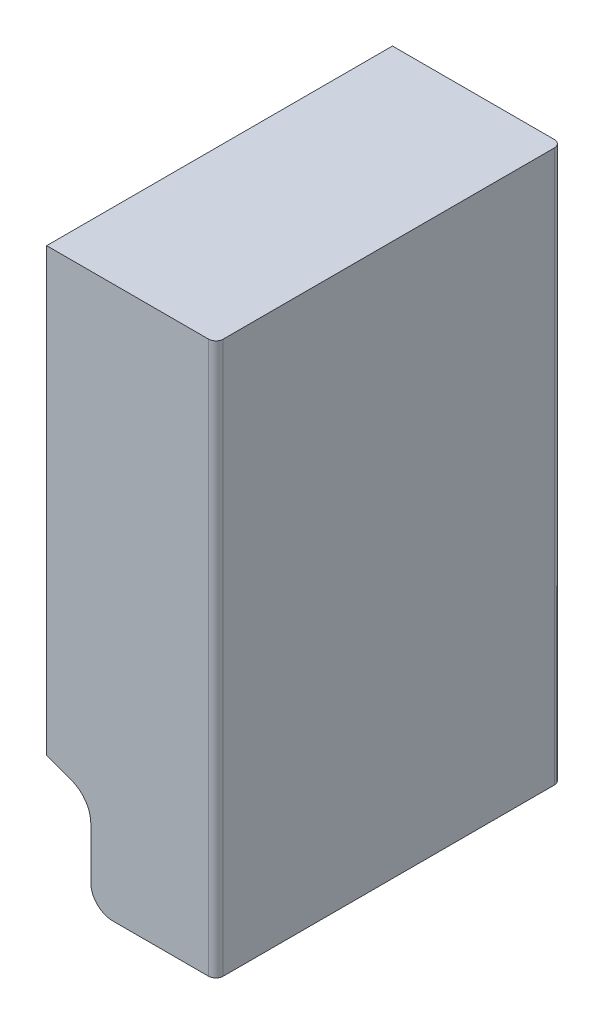
ISO-10303-21;
HEADER;
FILE_DESCRIPTION(('STEP AP214'),'2;1');
FILE_NAME('part.step','',(''),(''),'','','');
FILE_SCHEMA(('AUTOMOTIVE_DESIGN { 1 0 10303 214 1 1 1 1 }'));
ENDSEC;
DATA;
#1=APPLICATION_CONTEXT('core data for automotive mechanical design processes');
#2=APPLICATION_PROTOCOL_DEFINITION('international standard','automotive_design',2000,#1);
#3=PRODUCT_CONTEXT('',#1,'mechanical');
#4=PRODUCT('Part','Part','',(#3));
#5=PRODUCT_RELATED_PRODUCT_CATEGORY('part','',(#4));
#6=PRODUCT_DEFINITION_FORMATION('','',#4);
#7=PRODUCT_DEFINITION_CONTEXT('part definition',#1,'design');
#8=PRODUCT_DEFINITION('design','',#6,#7);
#9=PRODUCT_DEFINITION_SHAPE('','',#8);
#10=(LENGTH_UNIT() NAMED_UNIT(*) SI_UNIT(.MILLI.,.METRE.));
#11=(NAMED_UNIT(*) PLANE_ANGLE_UNIT() SI_UNIT($,.RADIAN.));
#12=(NAMED_UNIT(*) SI_UNIT($,.STERADIAN.) SOLID_ANGLE_UNIT());
#13=UNCERTAINTY_MEASURE_WITH_UNIT(LENGTH_MEASURE(1.E-05),#10,'distance_accuracy_value','');
#14=(GEOMETRIC_REPRESENTATION_CONTEXT(3) GLOBAL_UNCERTAINTY_ASSIGNED_CONTEXT((#13)) GLOBAL_UNIT_ASSIGNED_CONTEXT((#10,
#11,#12)) REPRESENTATION_CONTEXT('',''));
#15=CARTESIAN_POINT('',(0.,0.,0.));
#16=DIRECTION('',(0.,0.,1.));
#17=DIRECTION('',(1.,0.,0.));
#18=AXIS2_PLACEMENT_3D('',#15,#16,#17);
#19=CARTESIAN_POINT('',(11.5,-75.,23.5));
#20=DIRECTION('',(1.,0.,0.));
#21=DIRECTION('',(0.,0.,-1.));
#22=AXIS2_PLACEMENT_3D('',#19,#20,#21);
#23=PLANE('',#22);
#24=DIRECTION('',(0.,0.,-1.));
#25=VECTOR('',#24,1.);
#26=CARTESIAN_POINT('',(11.5,-75.,23.5));
#27=LINE('',#26,#25);
#28=CARTESIAN_POINT('',(11.5,-75.,22.5));
#29=VERTEX_POINT('',#28);
#30=CARTESIAN_POINT('',(11.5,-75.,-22.5));
#31=VERTEX_POINT('',#30);
#32=EDGE_CURVE('E176',#29,#31,#27,.T.);
#33=ORIENTED_EDGE('',*,*,#32,.T.);
#34=DIRECTION('',(0.,1.,0.));
#35=VECTOR('',#34,1.);
#36=CARTESIAN_POINT('',(11.5,-75.,-22.5));
#37=LINE('',#36,#35);
#38=CARTESIAN_POINT('',(11.5,0.,-22.5));
#39=VERTEX_POINT('',#38);
#40=EDGE_CURVE('E165',#31,#39,#37,.T.);
#41=ORIENTED_EDGE('',*,*,#40,.T.);
#42=DIRECTION('',(0.,0.,-1.));
#43=VECTOR('',#42,1.);
#44=CARTESIAN_POINT('',(11.5,0.,23.5));
#45=LINE('',#44,#43);
#46=CARTESIAN_POINT('',(11.5,0.,22.5));
#47=VERTEX_POINT('',#46);
#48=EDGE_CURVE('E130',#47,#39,#45,.T.);
#49=ORIENTED_EDGE('',*,*,#48,.F.);
#50=DIRECTION('',(0.,1.,0.));
#51=VECTOR('',#50,1.);
#52=CARTESIAN_POINT('',(11.5,-75.,22.5));
#53=LINE('',#52,#51);
#54=EDGE_CURVE('E163',#47,#29,#53,.F.);
#55=ORIENTED_EDGE('',*,*,#54,.T.);
#56=EDGE_LOOP('',(#33,#41,#49,#55));
#57=FACE_BOUND('',#56,.T.);
#58=ADVANCED_FACE('F41',(#57),#23,.T.);
#59=CARTESIAN_POINT('',(-11.5,-75.,23.5));
#60=DIRECTION('',(0.,0.,1.));
#61=DIRECTION('',(1.,0.,0.));
#62=AXIS2_PLACEMENT_3D('',#59,#60,#61);
#63=PLANE('',#62);
#64=DIRECTION('',(1.,0.,0.));
#65=VECTOR('',#64,1.);
#66=CARTESIAN_POINT('',(-11.5,-75.,23.5));
#67=LINE('',#66,#65);
#68=CARTESIAN_POINT('',(-2.50000000000001,-75.,23.5));
#69=VERTEX_POINT('',#68);
#70=CARTESIAN_POINT('',(10.5,-75.,23.5));
#71=VERTEX_POINT('',#70);
#72=EDGE_CURVE('E146',#69,#71,#67,.T.);
#73=ORIENTED_EDGE('',*,*,#72,.T.);
#74=DIRECTION('',(0.,1.,0.));
#75=VECTOR('',#74,1.);
#76=CARTESIAN_POINT('',(10.5,-75.,23.5));
#77=LINE('',#76,#75);
#78=CARTESIAN_POINT('',(10.5,0.,23.5));
#79=VERTEX_POINT('',#78);
#80=EDGE_CURVE('E11',#71,#79,#77,.T.);
#81=ORIENTED_EDGE('',*,*,#80,.T.);
#82=DIRECTION('',(1.,0.,0.));
#83=VECTOR('',#82,1.);
#84=CARTESIAN_POINT('',(-11.5,0.,23.5));
#85=LINE('',#84,#83);
#86=CARTESIAN_POINT('',(-11.5,0.,23.5));
#87=VERTEX_POINT('',#86);
#88=EDGE_CURVE('E183',#87,#79,#85,.T.);
#89=ORIENTED_EDGE('',*,*,#88,.F.);
#90=DIRECTION('',(0.,1.,0.));
#91=VECTOR('',#90,1.);
#92=CARTESIAN_POINT('',(-11.5,-75.,23.5));
#93=LINE('',#92,#91);
#94=CARTESIAN_POINT('',(-11.5,-60.015348441564,23.5));
#95=VERTEX_POINT('',#94);
#96=EDGE_CURVE('E145',#95,#87,#93,.T.);
#97=ORIENTED_EDGE('',*,*,#96,.F.);
#98=DIRECTION('',(-0.939692620785907,0.342020143325672,0.));
#99=VECTOR('',#98,1.);
#100=CARTESIAN_POINT('',(-8.13191942669733,-61.2412295168564,23.5));
#101=LINE('',#100,#99);
#102=CARTESIAN_POINT('',(-8.13191942669733,-61.2412295168564,23.5));
#103=VERTEX_POINT('',#102);
#104=EDGE_CURVE('E126',#103,#95,#101,.T.);
#105=ORIENTED_EDGE('',*,*,#104,.F.);
#106=CARTESIAN_POINT('',(-9.50000000000001,-65.,23.5));
#107=DIRECTION('',(0.,0.,1.));
#108=DIRECTION('',(1.,0.,0.));
#109=AXIS2_PLACEMENT_3D('',#106,#107,#108);
#110=CIRCLE('',#109,4.);
#111=CARTESIAN_POINT('',(-5.50000000000001,-65.,23.5));
#112=VERTEX_POINT('',#111);
#113=EDGE_CURVE('E234',#112,#103,#110,.T.);
#114=ORIENTED_EDGE('',*,*,#113,.F.);
#115=DIRECTION('',(0.,1.,0.));
#116=VECTOR('',#115,1.);
#117=CARTESIAN_POINT('',(-5.50000000000001,-65.,23.5));
#118=LINE('',#117,#116);
#119=CARTESIAN_POINT('',(-5.50000000000001,-72.,23.5));
#120=VERTEX_POINT('',#119);
#121=EDGE_CURVE('E140',#120,#112,#118,.T.);
#122=ORIENTED_EDGE('',*,*,#121,.F.);
#123=CARTESIAN_POINT('',(-2.50000000000001,-72.,23.5));
#124=DIRECTION('',(0.,0.,1.));
#125=DIRECTION('',(1.,0.,0.));
#126=AXIS2_PLACEMENT_3D('',#123,#124,#125);
#127=CIRCLE('',#126,3.);
#128=EDGE_CURVE('E156',#120,#69,#127,.T.);
#129=ORIENTED_EDGE('',*,*,#128,.T.);
#130=EDGE_LOOP('',(#73,#81,#89,#97,#105,#114,#122,#129));
#131=FACE_BOUND('',#130,.T.);
#132=ADVANCED_FACE('F195',(#131),#63,.T.);
#133=CARTESIAN_POINT('',(-11.5,-75.,23.5));
#134=DIRECTION('',(-1.,0.,0.));
#135=DIRECTION('',(0.,0.,1.));
#136=AXIS2_PLACEMENT_3D('',#133,#134,#135);
#137=PLANE('',#136);
#138=DIRECTION('',(0.,0.,1.));
#139=VECTOR('',#138,1.);
#140=CARTESIAN_POINT('',(-11.5,-60.015348441564,-23.501));
#141=LINE('',#140,#139);
#142=CARTESIAN_POINT('',(-11.5,-60.015348441564,-23.5));
#143=VERTEX_POINT('',#142);
#144=EDGE_CURVE('E120',#143,#95,#141,.T.);
#145=ORIENTED_EDGE('',*,*,#144,.T.);
#146=ORIENTED_EDGE('',*,*,#96,.T.);
#147=DIRECTION('',(0.,0.,1.));
#148=VECTOR('',#147,1.);
#149=CARTESIAN_POINT('',(-11.5,0.,23.5));
#150=LINE('',#149,#148);
#151=CARTESIAN_POINT('',(-11.5,0.,-23.5));
#152=VERTEX_POINT('',#151);
#153=EDGE_CURVE('E144',#152,#87,#150,.T.);
#154=ORIENTED_EDGE('',*,*,#153,.F.);
#155=DIRECTION('',(0.,1.,0.));
#156=VECTOR('',#155,1.);
#157=CARTESIAN_POINT('',(-11.5,-75.,-23.5));
#158=LINE('',#157,#156);
#159=EDGE_CURVE('E136',#143,#152,#158,.T.);
#160=ORIENTED_EDGE('',*,*,#159,.F.);
#161=EDGE_LOOP('',(#145,#146,#154,#160));
#162=FACE_BOUND('',#161,.T.);
#163=ADVANCED_FACE('F142',(#162),#137,.T.);
#164=CARTESIAN_POINT('',(-11.5,-75.,-23.5));
#165=DIRECTION('',(0.,0.,-1.));
#166=DIRECTION('',(-1.,0.,0.));
#167=AXIS2_PLACEMENT_3D('',#164,#165,#166);
#168=PLANE('',#167);
#169=DIRECTION('',(-1.,0.,0.));
#170=VECTOR('',#169,1.);
#171=CARTESIAN_POINT('',(-11.5,0.,-23.5));
#172=LINE('',#171,#170);
#173=CARTESIAN_POINT('',(10.5,0.,-23.5));
#174=VERTEX_POINT('',#173);
#175=EDGE_CURVE('E188',#174,#152,#172,.T.);
#176=ORIENTED_EDGE('',*,*,#175,.F.);
#177=DIRECTION('',(0.,1.,0.));
#178=VECTOR('',#177,1.);
#179=CARTESIAN_POINT('',(10.5,-75.,-23.5));
#180=LINE('',#179,#178);
#181=CARTESIAN_POINT('',(10.5,-75.,-23.5));
#182=VERTEX_POINT('',#181);
#183=EDGE_CURVE('E64',#174,#182,#180,.F.);
#184=ORIENTED_EDGE('',*,*,#183,.T.);
#185=DIRECTION('',(-1.,0.,0.));
#186=VECTOR('',#185,1.);
#187=CARTESIAN_POINT('',(-11.5,-75.,-23.5));
#188=LINE('',#187,#186);
#189=CARTESIAN_POINT('',(-2.50000000000001,-75.,-23.5));
#190=VERTEX_POINT('',#189);
#191=EDGE_CURVE('E150',#182,#190,#188,.T.);
#192=ORIENTED_EDGE('',*,*,#191,.T.);
#193=CARTESIAN_POINT('',(-2.50000000000001,-72.,-23.5));
#194=DIRECTION('',(0.,0.,-1.));
#195=DIRECTION('',(-1.,0.,0.));
#196=AXIS2_PLACEMENT_3D('',#193,#194,#195);
#197=CIRCLE('',#196,3.);
#198=CARTESIAN_POINT('',(-5.50000000000001,-72.,-23.5));
#199=VERTEX_POINT('',#198);
#200=EDGE_CURVE('E161',#190,#199,#197,.T.);
#201=ORIENTED_EDGE('',*,*,#200,.T.);
#202=DIRECTION('',(0.,1.,0.));
#203=VECTOR('',#202,1.);
#204=CARTESIAN_POINT('',(-5.50000000000001,-65.,-23.5));
#205=LINE('',#204,#203);
#206=CARTESIAN_POINT('',(-5.50000000000001,-65.,-23.5));
#207=VERTEX_POINT('',#206);
#208=EDGE_CURVE('E225',#199,#207,#205,.T.);
#209=ORIENTED_EDGE('',*,*,#208,.T.);
#210=CARTESIAN_POINT('',(-9.50000000000001,-65.,-23.5));
#211=DIRECTION('',(0.,0.,-1.));
#212=DIRECTION('',(-1.,0.,0.));
#213=AXIS2_PLACEMENT_3D('',#210,#211,#212);
#214=CIRCLE('',#213,4.);
#215=CARTESIAN_POINT('',(-8.13191942669733,-61.2412295168564,-23.5));
#216=VERTEX_POINT('',#215);
#217=EDGE_CURVE('E139',#207,#216,#214,.F.);
#218=ORIENTED_EDGE('',*,*,#217,.T.);
#219=DIRECTION('',(-0.939692620785907,0.342020143325672,0.));
#220=VECTOR('',#219,1.);
#221=CARTESIAN_POINT('',(-8.13191942669733,-61.2412295168564,-23.5));
#222=LINE('',#221,#220);
#223=EDGE_CURVE('E123',#216,#143,#222,.T.);
#224=ORIENTED_EDGE('',*,*,#223,.T.);
#225=ORIENTED_EDGE('',*,*,#159,.T.);
#226=EDGE_LOOP('',(#176,#184,#192,#201,#209,#218,#224,#225));
#227=FACE_BOUND('',#226,.T.);
#228=ADVANCED_FACE('F135',(#227),#168,.T.);
#229=CARTESIAN_POINT('',(0.,-75.,0.));
#230=DIRECTION('',(0.,-1.,0.));
#231=DIRECTION('',(0.,0.,-1.));
#232=AXIS2_PLACEMENT_3D('',#229,#230,#231);
#233=PLANE('',#232);
#234=ORIENTED_EDGE('',*,*,#191,.F.);
#235=CARTESIAN_POINT('',(10.5,-75.,-22.5));
#236=DIRECTION('',(0.,-1.,0.));
#237=DIRECTION('',(0.,0.,-1.));
#238=AXIS2_PLACEMENT_3D('',#235,#236,#237);
#239=CIRCLE('',#238,1.);
#240=EDGE_CURVE('E49',#182,#31,#239,.T.);
#241=ORIENTED_EDGE('',*,*,#240,.T.);
#242=ORIENTED_EDGE('',*,*,#32,.F.);
#243=CARTESIAN_POINT('',(10.5,-75.,22.5));
#244=DIRECTION('',(0.,-1.,0.));
#245=DIRECTION('',(0.,0.,-1.));
#246=AXIS2_PLACEMENT_3D('',#243,#244,#245);
#247=CIRCLE('',#246,1.);
#248=EDGE_CURVE('E56',#29,#71,#247,.T.);
#249=ORIENTED_EDGE('',*,*,#248,.T.);
#250=ORIENTED_EDGE('',*,*,#72,.F.);
#251=DIRECTION('',(0.,0.,1.));
#252=VECTOR('',#251,1.);
#253=CARTESIAN_POINT('',(-2.50000000000001,-75.,-23.5));
#254=LINE('',#253,#252);
#255=EDGE_CURVE('E158',#69,#190,#254,.F.);
#256=ORIENTED_EDGE('',*,*,#255,.T.);
#257=EDGE_LOOP('',(#234,#241,#242,#249,#250,#256));
#258=FACE_BOUND('',#257,.T.);
#259=ADVANCED_FACE('F175',(#258),#233,.T.);
#260=CARTESIAN_POINT('',(0.,0.,0.));
#261=DIRECTION('',(0.,-1.,0.));
#262=DIRECTION('',(0.,0.,-1.));
#263=AXIS2_PLACEMENT_3D('',#260,#261,#262);
#264=PLANE('',#263);
#265=ORIENTED_EDGE('',*,*,#48,.T.);
#266=CARTESIAN_POINT('',(10.5,0.,-22.5));
#267=DIRECTION('',(0.,-1.,0.));
#268=DIRECTION('',(0.,0.,-1.));
#269=AXIS2_PLACEMENT_3D('',#266,#267,#268);
#270=CIRCLE('',#269,1.);
#271=EDGE_CURVE('E170',#39,#174,#270,.F.);
#272=ORIENTED_EDGE('',*,*,#271,.T.);
#273=ORIENTED_EDGE('',*,*,#175,.T.);
#274=ORIENTED_EDGE('',*,*,#153,.T.);
#275=ORIENTED_EDGE('',*,*,#88,.T.);
#276=CARTESIAN_POINT('',(10.5,0.,22.5));
#277=DIRECTION('',(0.,-1.,0.));
#278=DIRECTION('',(0.,0.,-1.));
#279=AXIS2_PLACEMENT_3D('',#276,#277,#278);
#280=CIRCLE('',#279,1.);
#281=EDGE_CURVE('E168',#79,#47,#280,.F.);
#282=ORIENTED_EDGE('',*,*,#281,.T.);
#283=EDGE_LOOP('',(#265,#272,#273,#274,#275,#282));
#284=FACE_BOUND('',#283,.T.);
#285=ADVANCED_FACE('F187',(#284),#264,.F.);
#286=CARTESIAN_POINT('',(-8.13191942669733,-61.2412295168564,-23.501));
#287=DIRECTION('',(0.342020143325672,0.939692620785907,0.));
#288=DIRECTION('',(-0.939692620785907,0.342020143325672,0.));
#289=AXIS2_PLACEMENT_3D('',#286,#287,#288);
#290=PLANE('',#289);
#291=DIRECTION('',(0.,0.,1.));
#292=VECTOR('',#291,1.);
#293=CARTESIAN_POINT('',(-8.13191942669733,-61.2412295168564,-23.501));
#294=LINE('',#293,#292);
#295=EDGE_CURVE('E131',#216,#103,#294,.T.);
#296=ORIENTED_EDGE('',*,*,#295,.T.);
#297=ORIENTED_EDGE('',*,*,#104,.T.);
#298=ORIENTED_EDGE('',*,*,#144,.F.);
#299=ORIENTED_EDGE('',*,*,#223,.F.);
#300=EDGE_LOOP('',(#296,#297,#298,#299));
#301=FACE_BOUND('',#300,.T.);
#302=ADVANCED_FACE('F122',(#301),#290,.F.);
#303=CARTESIAN_POINT('',(-9.50000000000001,-65.,-23.501));
#304=DIRECTION('',(0.,0.,1.));
#305=DIRECTION('',(1.,0.,0.));
#306=AXIS2_PLACEMENT_3D('',#303,#304,#305);
#307=CYLINDRICAL_SURFACE('',#306,4.);
#308=DIRECTION('',(0.,0.,1.));
#309=VECTOR('',#308,1.);
#310=CARTESIAN_POINT('',(-5.50000000000001,-65.,-23.501));
#311=LINE('',#310,#309);
#312=EDGE_CURVE('E229',#207,#112,#311,.T.);
#313=ORIENTED_EDGE('',*,*,#312,.T.);
#314=ORIENTED_EDGE('',*,*,#113,.T.);
#315=ORIENTED_EDGE('',*,*,#295,.F.);
#316=ORIENTED_EDGE('',*,*,#217,.F.);
#317=EDGE_LOOP('',(#313,#314,#315,#316));
#318=FACE_BOUND('',#317,.T.);
#319=ADVANCED_FACE('F218',(#318),#307,.F.);
#320=CARTESIAN_POINT('',(-5.50000000000001,-65.,-23.501));
#321=DIRECTION('',(1.,0.,0.));
#322=DIRECTION('',(0.,1.,0.));
#323=AXIS2_PLACEMENT_3D('',#320,#321,#322);
#324=PLANE('',#323);
#325=ORIENTED_EDGE('',*,*,#208,.F.);
#326=DIRECTION('',(0.,0.,1.));
#327=VECTOR('',#326,1.);
#328=CARTESIAN_POINT('',(-5.50000000000001,-72.,23.5));
#329=LINE('',#328,#327);
#330=EDGE_CURVE('E148',#199,#120,#329,.T.);
#331=ORIENTED_EDGE('',*,*,#330,.T.);
#332=ORIENTED_EDGE('',*,*,#121,.T.);
#333=ORIENTED_EDGE('',*,*,#312,.F.);
#334=EDGE_LOOP('',(#325,#331,#332,#333));
#335=FACE_BOUND('',#334,.T.);
#336=ADVANCED_FACE('F213',(#335),#324,.F.);
#337=CARTESIAN_POINT('',(-2.50000000000001,-72.,-23.501));
#338=DIRECTION('',(0.,0.,-1.));
#339=DIRECTION('',(-1.,0.,0.));
#340=AXIS2_PLACEMENT_3D('',#337,#338,#339);
#341=CYLINDRICAL_SURFACE('',#340,3.);
#342=ORIENTED_EDGE('',*,*,#200,.F.);
#343=ORIENTED_EDGE('',*,*,#255,.F.);
#344=ORIENTED_EDGE('',*,*,#128,.F.);
#345=ORIENTED_EDGE('',*,*,#330,.F.);
#346=EDGE_LOOP('',(#342,#343,#344,#345));
#347=FACE_BOUND('',#346,.T.);
#348=ADVANCED_FACE('F202',(#347),#341,.T.);
#349=CARTESIAN_POINT('',(10.5,-75.,-22.5));
#350=DIRECTION('',(0.,1.,0.));
#351=DIRECTION('',(0.,0.,1.));
#352=AXIS2_PLACEMENT_3D('',#349,#350,#351);
#353=CYLINDRICAL_SURFACE('',#352,1.);
#354=ORIENTED_EDGE('',*,*,#240,.F.);
#355=ORIENTED_EDGE('',*,*,#183,.F.);
#356=ORIENTED_EDGE('',*,*,#271,.F.);
#357=ORIENTED_EDGE('',*,*,#40,.F.);
#358=EDGE_LOOP('',(#354,#355,#356,#357));
#359=FACE_BOUND('',#358,.T.);
#360=ADVANCED_FACE('F185',(#359),#353,.T.);
#361=CARTESIAN_POINT('',(10.5,-75.,22.5));
#362=DIRECTION('',(0.,1.,0.));
#363=DIRECTION('',(0.,0.,1.));
#364=AXIS2_PLACEMENT_3D('',#361,#362,#363);
#365=CYLINDRICAL_SURFACE('',#364,1.);
#366=ORIENTED_EDGE('',*,*,#248,.F.);
#367=ORIENTED_EDGE('',*,*,#54,.F.);
#368=ORIENTED_EDGE('',*,*,#281,.F.);
#369=ORIENTED_EDGE('',*,*,#80,.F.);
#370=EDGE_LOOP('',(#366,#367,#368,#369));
#371=FACE_BOUND('',#370,.T.);
#372=ADVANCED_FACE('F43',(#371),#365,.T.);
#373=CLOSED_SHELL('',(#58,#132,#163,#228,#259,#285,#302,#319,#336,#348,#360,#372));
#374=MANIFOLD_SOLID_BREP('B2',#373);
#375=ADVANCED_BREP_SHAPE_REPRESENTATION('',(#18,#374),#14);
#376=SHAPE_DEFINITION_REPRESENTATION(#9,#375);
ENDSEC;
END-ISO-10303-21;
